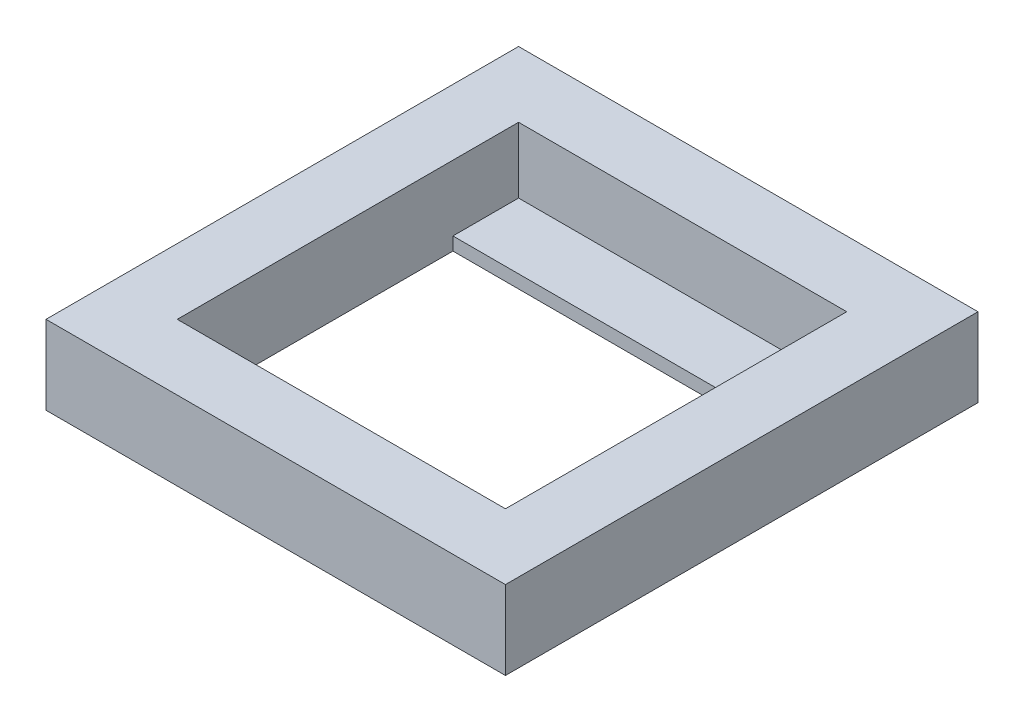
ISO-10303-21;
HEADER;
FILE_DESCRIPTION(('STEP AP214'),'2;1');
FILE_NAME('part.step','',(''),(''),'','','');
FILE_SCHEMA(('AUTOMOTIVE_DESIGN { 1 0 10303 214 1 1 1 1 }'));
ENDSEC;
DATA;
#1=APPLICATION_CONTEXT('core data for automotive mechanical design processes');
#2=APPLICATION_PROTOCOL_DEFINITION('international standard','automotive_design',2000,#1);
#3=PRODUCT_CONTEXT('',#1,'mechanical');
#4=PRODUCT('Part','Part','',(#3));
#5=PRODUCT_RELATED_PRODUCT_CATEGORY('part','',(#4));
#6=PRODUCT_DEFINITION_FORMATION('','',#4);
#7=PRODUCT_DEFINITION_CONTEXT('part definition',#1,'design');
#8=PRODUCT_DEFINITION('design','',#6,#7);
#9=PRODUCT_DEFINITION_SHAPE('','',#8);
#10=(LENGTH_UNIT() NAMED_UNIT(*) SI_UNIT(.MILLI.,.METRE.));
#11=(NAMED_UNIT(*) PLANE_ANGLE_UNIT() SI_UNIT($,.RADIAN.));
#12=(NAMED_UNIT(*) SI_UNIT($,.STERADIAN.) SOLID_ANGLE_UNIT());
#13=UNCERTAINTY_MEASURE_WITH_UNIT(LENGTH_MEASURE(1.E-05),#10,'distance_accuracy_value','');
#14=(GEOMETRIC_REPRESENTATION_CONTEXT(3) GLOBAL_UNCERTAINTY_ASSIGNED_CONTEXT((#13)) GLOBAL_UNIT_ASSIGNED_CONTEXT((#10,
#11,#12)) REPRESENTATION_CONTEXT('',''));
#15=CARTESIAN_POINT('',(0.,0.,0.));
#16=DIRECTION('',(0.,0.,1.));
#17=DIRECTION('',(1.,0.,0.));
#18=AXIS2_PLACEMENT_3D('',#15,#16,#17);
#19=CARTESIAN_POINT('',(0.,2.,0.));
#20=DIRECTION('',(0.,-1.,0.));
#21=DIRECTION('',(0.,0.,-1.));
#22=AXIS2_PLACEMENT_3D('',#19,#20,#21);
#23=PLANE('',#22);
#24=DIRECTION('',(0.,0.,1.));
#25=VECTOR('',#24,1.);
#26=CARTESIAN_POINT('',(60.,2.,0.));
#27=LINE('',#26,#25);
#28=CARTESIAN_POINT('',(60.,2.,-62.));
#29=VERTEX_POINT('',#28);
#30=CARTESIAN_POINT('',(60.,2.,-52.));
#31=VERTEX_POINT('',#30);
#32=EDGE_CURVE('E56',#29,#31,#27,.T.);
#33=ORIENTED_EDGE('',*,*,#32,.F.);
#34=DIRECTION('',(1.,0.,0.));
#35=VECTOR('',#34,1.);
#36=CARTESIAN_POINT('',(0.,2.,-62.));
#37=LINE('',#36,#35);
#38=CARTESIAN_POINT('',(10.,2.,-62.));
#39=VERTEX_POINT('',#38);
#40=EDGE_CURVE('E60',#39,#29,#37,.T.);
#41=ORIENTED_EDGE('',*,*,#40,.F.);
#42=DIRECTION('',(0.,0.,-1.));
#43=VECTOR('',#42,1.);
#44=CARTESIAN_POINT('',(10.,2.,0.));
#45=LINE('',#44,#43);
#46=CARTESIAN_POINT('',(10.,2.,-52.));
#47=VERTEX_POINT('',#46);
#48=EDGE_CURVE('E11',#47,#39,#45,.T.);
#49=ORIENTED_EDGE('',*,*,#48,.F.);
#50=DIRECTION('',(-1.,0.,0.));
#51=VECTOR('',#50,1.);
#52=CARTESIAN_POINT('',(10.,2.,-52.));
#53=LINE('',#52,#51);
#54=EDGE_CURVE('E157',#31,#47,#53,.T.);
#55=ORIENTED_EDGE('',*,*,#54,.F.);
#56=EDGE_LOOP('',(#33,#41,#49,#55));
#57=FACE_BOUND('',#56,.T.);
#58=ADVANCED_FACE('F38',(#57),#23,.F.);
#59=CARTESIAN_POINT('',(60.,2.,-20.));
#60=VERTEX_POINT('',#59);
#61=CARTESIAN_POINT('',(60.,2.,-9.99999999999999));
#62=VERTEX_POINT('',#61);
#63=EDGE_CURVE('E47',#60,#62,#27,.T.);
#64=ORIENTED_EDGE('',*,*,#63,.F.);
#65=DIRECTION('',(1.,0.,0.));
#66=VECTOR('',#65,1.);
#67=CARTESIAN_POINT('',(10.,2.,-20.));
#68=LINE('',#67,#66);
#69=CARTESIAN_POINT('',(10.,2.,-20.));
#70=VERTEX_POINT('',#69);
#71=EDGE_CURVE('E154',#70,#60,#68,.T.);
#72=ORIENTED_EDGE('',*,*,#71,.F.);
#73=CARTESIAN_POINT('',(10.,2.,-9.99999999999999));
#74=VERTEX_POINT('',#73);
#75=EDGE_CURVE('E49',#74,#70,#45,.T.);
#76=ORIENTED_EDGE('',*,*,#75,.F.);
#77=DIRECTION('',(-1.,0.,0.));
#78=VECTOR('',#77,1.);
#79=CARTESIAN_POINT('',(0.,2.,-9.99999999999999));
#80=LINE('',#79,#78);
#81=EDGE_CURVE('E209',#62,#74,#80,.T.);
#82=ORIENTED_EDGE('',*,*,#81,.F.);
#83=EDGE_LOOP('',(#64,#72,#76,#82));
#84=FACE_BOUND('',#83,.T.);
#85=ADVANCED_FACE('F230',(#84),#23,.F.);
#86=CARTESIAN_POINT('',(0.,2.,0.));
#87=DIRECTION('',(1.,0.,0.));
#88=DIRECTION('',(0.,0.,-1.));
#89=AXIS2_PLACEMENT_3D('',#86,#87,#88);
#90=PLANE('',#89);
#91=DIRECTION('',(0.,0.,1.));
#92=VECTOR('',#91,1.);
#93=CARTESIAN_POINT('',(0.,0.,0.));
#94=LINE('',#93,#92);
#95=CARTESIAN_POINT('',(0.,0.,-72.));
#96=VERTEX_POINT('',#95);
#97=CARTESIAN_POINT('',(0.,0.,0.));
#98=VERTEX_POINT('',#97);
#99=EDGE_CURVE('E169',#96,#98,#94,.T.);
#100=ORIENTED_EDGE('',*,*,#99,.T.);
#101=DIRECTION('',(0.,-1.,0.));
#102=VECTOR('',#101,1.);
#103=CARTESIAN_POINT('',(0.,2.,0.));
#104=LINE('',#103,#102);
#105=CARTESIAN_POINT('',(0.,12.,0.));
#106=VERTEX_POINT('',#105);
#107=EDGE_CURVE('E192',#106,#98,#104,.T.);
#108=ORIENTED_EDGE('',*,*,#107,.F.);
#109=DIRECTION('',(0.,0.,1.));
#110=VECTOR('',#109,1.);
#111=CARTESIAN_POINT('',(0.,12.,0.));
#112=LINE('',#111,#110);
#113=CARTESIAN_POINT('',(0.,12.,-72.));
#114=VERTEX_POINT('',#113);
#115=EDGE_CURVE('E267',#114,#106,#112,.T.);
#116=ORIENTED_EDGE('',*,*,#115,.F.);
#117=DIRECTION('',(0.,-1.,0.));
#118=VECTOR('',#117,1.);
#119=CARTESIAN_POINT('',(0.,2.,-72.));
#120=LINE('',#119,#118);
#121=EDGE_CURVE('E183',#114,#96,#120,.T.);
#122=ORIENTED_EDGE('',*,*,#121,.T.);
#123=EDGE_LOOP('',(#100,#108,#116,#122));
#124=FACE_BOUND('',#123,.T.);
#125=ADVANCED_FACE('F40',(#124),#90,.F.);
#126=CARTESIAN_POINT('',(0.,2.,0.));
#127=DIRECTION('',(0.,0.,-1.));
#128=DIRECTION('',(-1.,0.,0.));
#129=AXIS2_PLACEMENT_3D('',#126,#127,#128);
#130=PLANE('',#129);
#131=DIRECTION('',(1.,0.,0.));
#132=VECTOR('',#131,1.);
#133=CARTESIAN_POINT('',(0.,0.,0.));
#134=LINE('',#133,#132);
#135=CARTESIAN_POINT('',(70.,0.,0.));
#136=VERTEX_POINT('',#135);
#137=EDGE_CURVE('E177',#98,#136,#134,.T.);
#138=ORIENTED_EDGE('',*,*,#137,.T.);
#139=DIRECTION('',(0.,-1.,0.));
#140=VECTOR('',#139,1.);
#141=CARTESIAN_POINT('',(70.,2.,0.));
#142=LINE('',#141,#140);
#143=CARTESIAN_POINT('',(70.,12.,0.));
#144=VERTEX_POINT('',#143);
#145=EDGE_CURVE('E189',#144,#136,#142,.T.);
#146=ORIENTED_EDGE('',*,*,#145,.F.);
#147=DIRECTION('',(1.,0.,0.));
#148=VECTOR('',#147,1.);
#149=CARTESIAN_POINT('',(0.,12.,0.));
#150=LINE('',#149,#148);
#151=EDGE_CURVE('E268',#106,#144,#150,.T.);
#152=ORIENTED_EDGE('',*,*,#151,.F.);
#153=ORIENTED_EDGE('',*,*,#107,.T.);
#154=EDGE_LOOP('',(#138,#146,#152,#153));
#155=FACE_BOUND('',#154,.T.);
#156=ADVANCED_FACE('F237',(#155),#130,.F.);
#157=CARTESIAN_POINT('',(70.,2.,0.));
#158=DIRECTION('',(-1.,0.,0.));
#159=DIRECTION('',(0.,0.,1.));
#160=AXIS2_PLACEMENT_3D('',#157,#158,#159);
#161=PLANE('',#160);
#162=DIRECTION('',(0.,0.,-1.));
#163=VECTOR('',#162,1.);
#164=CARTESIAN_POINT('',(70.,0.,0.));
#165=LINE('',#164,#163);
#166=CARTESIAN_POINT('',(70.,0.,-72.));
#167=VERTEX_POINT('',#166);
#168=EDGE_CURVE('E179',#136,#167,#165,.T.);
#169=ORIENTED_EDGE('',*,*,#168,.T.);
#170=DIRECTION('',(0.,-1.,0.));
#171=VECTOR('',#170,1.);
#172=CARTESIAN_POINT('',(70.,2.,-72.));
#173=LINE('',#172,#171);
#174=CARTESIAN_POINT('',(70.,12.,-72.));
#175=VERTEX_POINT('',#174);
#176=EDGE_CURVE('E186',#175,#167,#173,.T.);
#177=ORIENTED_EDGE('',*,*,#176,.F.);
#178=DIRECTION('',(0.,0.,-1.));
#179=VECTOR('',#178,1.);
#180=CARTESIAN_POINT('',(70.,12.,0.));
#181=LINE('',#180,#179);
#182=EDGE_CURVE('E261',#144,#175,#181,.T.);
#183=ORIENTED_EDGE('',*,*,#182,.F.);
#184=ORIENTED_EDGE('',*,*,#145,.T.);
#185=EDGE_LOOP('',(#169,#177,#183,#184));
#186=FACE_BOUND('',#185,.T.);
#187=ADVANCED_FACE('F247',(#186),#161,.F.);
#188=CARTESIAN_POINT('',(0.,2.,-72.));
#189=DIRECTION('',(0.,0.,1.));
#190=DIRECTION('',(1.,0.,0.));
#191=AXIS2_PLACEMENT_3D('',#188,#189,#190);
#192=PLANE('',#191);
#193=DIRECTION('',(-1.,0.,0.));
#194=VECTOR('',#193,1.);
#195=CARTESIAN_POINT('',(0.,0.,-72.));
#196=LINE('',#195,#194);
#197=EDGE_CURVE('E181',#167,#96,#196,.T.);
#198=ORIENTED_EDGE('',*,*,#197,.T.);
#199=ORIENTED_EDGE('',*,*,#121,.F.);
#200=DIRECTION('',(-1.,0.,0.));
#201=VECTOR('',#200,1.);
#202=CARTESIAN_POINT('',(0.,12.,-72.));
#203=LINE('',#202,#201);
#204=EDGE_CURVE('E214',#175,#114,#203,.T.);
#205=ORIENTED_EDGE('',*,*,#204,.F.);
#206=ORIENTED_EDGE('',*,*,#176,.T.);
#207=EDGE_LOOP('',(#198,#199,#205,#206));
#208=FACE_BOUND('',#207,.T.);
#209=ADVANCED_FACE('F244',(#208),#192,.F.);
#210=CARTESIAN_POINT('',(0.,0.,0.));
#211=DIRECTION('',(0.,-1.,0.));
#212=DIRECTION('',(0.,0.,-1.));
#213=AXIS2_PLACEMENT_3D('',#210,#211,#212);
#214=PLANE('',#213);
#215=DIRECTION('',(0.,0.,-1.));
#216=VECTOR('',#215,1.);
#217=CARTESIAN_POINT('',(10.,0.,0.));
#218=LINE('',#217,#216);
#219=CARTESIAN_POINT('',(10.,0.,-20.));
#220=VERTEX_POINT('',#219);
#221=CARTESIAN_POINT('',(10.,0.,-52.));
#222=VERTEX_POINT('',#221);
#223=EDGE_CURVE('E42',#220,#222,#218,.T.);
#224=ORIENTED_EDGE('',*,*,#223,.F.);
#225=DIRECTION('',(-1.,0.,0.));
#226=VECTOR('',#225,1.);
#227=CARTESIAN_POINT('',(0.,0.,-20.));
#228=LINE('',#227,#226);
#229=CARTESIAN_POINT('',(60.,0.,-20.));
#230=VERTEX_POINT('',#229);
#231=EDGE_CURVE('E195',#230,#220,#228,.T.);
#232=ORIENTED_EDGE('',*,*,#231,.F.);
#233=DIRECTION('',(0.,0.,1.));
#234=VECTOR('',#233,1.);
#235=CARTESIAN_POINT('',(60.,0.,0.));
#236=LINE('',#235,#234);
#237=CARTESIAN_POINT('',(60.,0.,-52.));
#238=VERTEX_POINT('',#237);
#239=EDGE_CURVE('E197',#238,#230,#236,.T.);
#240=ORIENTED_EDGE('',*,*,#239,.F.);
#241=DIRECTION('',(1.,0.,0.));
#242=VECTOR('',#241,1.);
#243=CARTESIAN_POINT('',(0.,0.,-52.));
#244=LINE('',#243,#242);
#245=EDGE_CURVE('E198',#222,#238,#244,.T.);
#246=ORIENTED_EDGE('',*,*,#245,.F.);
#247=EDGE_LOOP('',(#224,#232,#240,#246));
#248=FACE_BOUND('',#247,.T.);
#249=ORIENTED_EDGE('',*,*,#99,.F.);
#250=ORIENTED_EDGE('',*,*,#197,.F.);
#251=ORIENTED_EDGE('',*,*,#168,.F.);
#252=ORIENTED_EDGE('',*,*,#137,.F.);
#253=EDGE_LOOP('',(#249,#250,#251,#252));
#254=FACE_BOUND('',#253,.T.);
#255=ADVANCED_FACE('F224',(#248,#254),#214,.T.);
#256=CARTESIAN_POINT('',(10.,-10.,-52.));
#257=DIRECTION('',(-1.,0.,0.));
#258=DIRECTION('',(0.,0.,1.));
#259=AXIS2_PLACEMENT_3D('',#256,#257,#258);
#260=PLANE('',#259);
#261=ORIENTED_EDGE('',*,*,#223,.T.);
#262=DIRECTION('',(0.,1.,0.));
#263=VECTOR('',#262,1.);
#264=CARTESIAN_POINT('',(10.,-10.,-52.));
#265=LINE('',#264,#263);
#266=EDGE_CURVE('E166',#222,#47,#265,.T.);
#267=ORIENTED_EDGE('',*,*,#266,.T.);
#268=ORIENTED_EDGE('',*,*,#48,.T.);
#269=DIRECTION('',(0.,-1.,0.));
#270=VECTOR('',#269,1.);
#271=CARTESIAN_POINT('',(10.,12.,-62.));
#272=LINE('',#271,#270);
#273=CARTESIAN_POINT('',(10.,12.,-62.));
#274=VERTEX_POINT('',#273);
#275=EDGE_CURVE('E159',#274,#39,#272,.T.);
#276=ORIENTED_EDGE('',*,*,#275,.F.);
#277=DIRECTION('',(0.,0.,-1.));
#278=VECTOR('',#277,1.);
#279=CARTESIAN_POINT('',(10.,12.,0.));
#280=LINE('',#279,#278);
#281=CARTESIAN_POINT('',(10.,12.,-9.99999999999999));
#282=VERTEX_POINT('',#281);
#283=EDGE_CURVE('E138',#282,#274,#280,.T.);
#284=ORIENTED_EDGE('',*,*,#283,.F.);
#285=DIRECTION('',(0.,-1.,0.));
#286=VECTOR('',#285,1.);
#287=CARTESIAN_POINT('',(10.,12.,-9.99999999999999));
#288=LINE('',#287,#286);
#289=EDGE_CURVE('E135',#282,#74,#288,.T.);
#290=ORIENTED_EDGE('',*,*,#289,.T.);
#291=ORIENTED_EDGE('',*,*,#75,.T.);
#292=DIRECTION('',(0.,1.,0.));
#293=VECTOR('',#292,1.);
#294=CARTESIAN_POINT('',(10.,-10.,-20.));
#295=LINE('',#294,#293);
#296=EDGE_CURVE('E165',#220,#70,#295,.T.);
#297=ORIENTED_EDGE('',*,*,#296,.F.);
#298=EDGE_LOOP('',(#261,#267,#268,#276,#284,#290,#291,#297));
#299=FACE_BOUND('',#298,.T.);
#300=ADVANCED_FACE('F219',(#299),#260,.F.);
#301=CARTESIAN_POINT('',(10.,-10.,-52.));
#302=DIRECTION('',(0.,0.,-1.));
#303=DIRECTION('',(-1.,0.,0.));
#304=AXIS2_PLACEMENT_3D('',#301,#302,#303);
#305=PLANE('',#304);
#306=ORIENTED_EDGE('',*,*,#245,.T.);
#307=DIRECTION('',(0.,1.,0.));
#308=VECTOR('',#307,1.);
#309=CARTESIAN_POINT('',(60.,-10.,-52.));
#310=LINE('',#309,#308);
#311=EDGE_CURVE('E170',#238,#31,#310,.T.);
#312=ORIENTED_EDGE('',*,*,#311,.T.);
#313=ORIENTED_EDGE('',*,*,#54,.T.);
#314=ORIENTED_EDGE('',*,*,#266,.F.);
#315=EDGE_LOOP('',(#306,#312,#313,#314));
#316=FACE_BOUND('',#315,.T.);
#317=ADVANCED_FACE('F220',(#316),#305,.F.);
#318=CARTESIAN_POINT('',(60.,-10.,-52.));
#319=DIRECTION('',(1.,0.,0.));
#320=DIRECTION('',(0.,0.,-1.));
#321=AXIS2_PLACEMENT_3D('',#318,#319,#320);
#322=PLANE('',#321);
#323=ORIENTED_EDGE('',*,*,#239,.T.);
#324=DIRECTION('',(0.,1.,0.));
#325=VECTOR('',#324,1.);
#326=CARTESIAN_POINT('',(60.,-10.,-20.));
#327=LINE('',#326,#325);
#328=EDGE_CURVE('E172',#230,#60,#327,.T.);
#329=ORIENTED_EDGE('',*,*,#328,.T.);
#330=ORIENTED_EDGE('',*,*,#63,.T.);
#331=DIRECTION('',(0.,-1.,0.));
#332=VECTOR('',#331,1.);
#333=CARTESIAN_POINT('',(60.,12.,-9.99999999999999));
#334=LINE('',#333,#332);
#335=CARTESIAN_POINT('',(60.,12.,-9.99999999999999));
#336=VERTEX_POINT('',#335);
#337=EDGE_CURVE('E133',#336,#62,#334,.T.);
#338=ORIENTED_EDGE('',*,*,#337,.F.);
#339=DIRECTION('',(0.,0.,1.));
#340=VECTOR('',#339,1.);
#341=CARTESIAN_POINT('',(60.,12.,0.));
#342=LINE('',#341,#340);
#343=CARTESIAN_POINT('',(60.,12.,-62.));
#344=VERTEX_POINT('',#343);
#345=EDGE_CURVE('E139',#344,#336,#342,.T.);
#346=ORIENTED_EDGE('',*,*,#345,.F.);
#347=DIRECTION('',(0.,-1.,0.));
#348=VECTOR('',#347,1.);
#349=CARTESIAN_POINT('',(60.,12.,-62.));
#350=LINE('',#349,#348);
#351=EDGE_CURVE('E213',#344,#29,#350,.T.);
#352=ORIENTED_EDGE('',*,*,#351,.T.);
#353=ORIENTED_EDGE('',*,*,#32,.T.);
#354=ORIENTED_EDGE('',*,*,#311,.F.);
#355=EDGE_LOOP('',(#323,#329,#330,#338,#346,#352,#353,#354));
#356=FACE_BOUND('',#355,.T.);
#357=ADVANCED_FACE('F152',(#356),#322,.F.);
#358=CARTESIAN_POINT('',(10.,-10.,-20.));
#359=DIRECTION('',(0.,0.,1.));
#360=DIRECTION('',(1.,0.,0.));
#361=AXIS2_PLACEMENT_3D('',#358,#359,#360);
#362=PLANE('',#361);
#363=ORIENTED_EDGE('',*,*,#231,.T.);
#364=ORIENTED_EDGE('',*,*,#296,.T.);
#365=ORIENTED_EDGE('',*,*,#71,.T.);
#366=ORIENTED_EDGE('',*,*,#328,.F.);
#367=EDGE_LOOP('',(#363,#364,#365,#366));
#368=FACE_BOUND('',#367,.T.);
#369=ADVANCED_FACE('F227',(#368),#362,.F.);
#370=CARTESIAN_POINT('',(0.,12.,-9.99999999999999));
#371=DIRECTION('',(0.,0.,1.));
#372=DIRECTION('',(1.,0.,0.));
#373=AXIS2_PLACEMENT_3D('',#370,#371,#372);
#374=PLANE('',#373);
#375=ORIENTED_EDGE('',*,*,#81,.T.);
#376=ORIENTED_EDGE('',*,*,#289,.F.);
#377=DIRECTION('',(-1.,0.,0.));
#378=VECTOR('',#377,1.);
#379=CARTESIAN_POINT('',(0.,12.,-9.99999999999999));
#380=LINE('',#379,#378);
#381=EDGE_CURVE('E128',#336,#282,#380,.T.);
#382=ORIENTED_EDGE('',*,*,#381,.F.);
#383=ORIENTED_EDGE('',*,*,#337,.T.);
#384=EDGE_LOOP('',(#375,#376,#382,#383));
#385=FACE_BOUND('',#384,.T.);
#386=ADVANCED_FACE('F131',(#385),#374,.F.);
#387=CARTESIAN_POINT('',(0.,12.,-62.));
#388=DIRECTION('',(0.,0.,-1.));
#389=DIRECTION('',(-1.,0.,0.));
#390=AXIS2_PLACEMENT_3D('',#387,#388,#389);
#391=PLANE('',#390);
#392=ORIENTED_EDGE('',*,*,#40,.T.);
#393=ORIENTED_EDGE('',*,*,#351,.F.);
#394=DIRECTION('',(1.,0.,0.));
#395=VECTOR('',#394,1.);
#396=CARTESIAN_POINT('',(0.,12.,-62.));
#397=LINE('',#396,#395);
#398=EDGE_CURVE('E145',#274,#344,#397,.T.);
#399=ORIENTED_EDGE('',*,*,#398,.F.);
#400=ORIENTED_EDGE('',*,*,#275,.T.);
#401=EDGE_LOOP('',(#392,#393,#399,#400));
#402=FACE_BOUND('',#401,.T.);
#403=ADVANCED_FACE('F218',(#402),#391,.F.);
#404=CARTESIAN_POINT('',(0.,12.,0.));
#405=DIRECTION('',(0.,1.,0.));
#406=DIRECTION('',(0.,0.,1.));
#407=AXIS2_PLACEMENT_3D('',#404,#405,#406);
#408=PLANE('',#407);
#409=ORIENTED_EDGE('',*,*,#345,.T.);
#410=ORIENTED_EDGE('',*,*,#381,.T.);
#411=ORIENTED_EDGE('',*,*,#283,.T.);
#412=ORIENTED_EDGE('',*,*,#398,.T.);
#413=EDGE_LOOP('',(#409,#410,#411,#412));
#414=FACE_BOUND('',#413,.T.);
#415=ORIENTED_EDGE('',*,*,#115,.T.);
#416=ORIENTED_EDGE('',*,*,#151,.T.);
#417=ORIENTED_EDGE('',*,*,#182,.T.);
#418=ORIENTED_EDGE('',*,*,#204,.T.);
#419=EDGE_LOOP('',(#415,#416,#417,#418));
#420=FACE_BOUND('',#419,.T.);
#421=ADVANCED_FACE('F142',(#414,#420),#408,.T.);
#422=CLOSED_SHELL('',(#58,#85,#125,#156,#187,#209,#255,#300,#317,#357,#369,#386,#403,#421));
#423=MANIFOLD_SOLID_BREP('B2',#422);
#424=ADVANCED_BREP_SHAPE_REPRESENTATION('',(#18,#423),#14);
#425=SHAPE_DEFINITION_REPRESENTATION(#9,#424);
ENDSEC;
END-ISO-10303-21;
